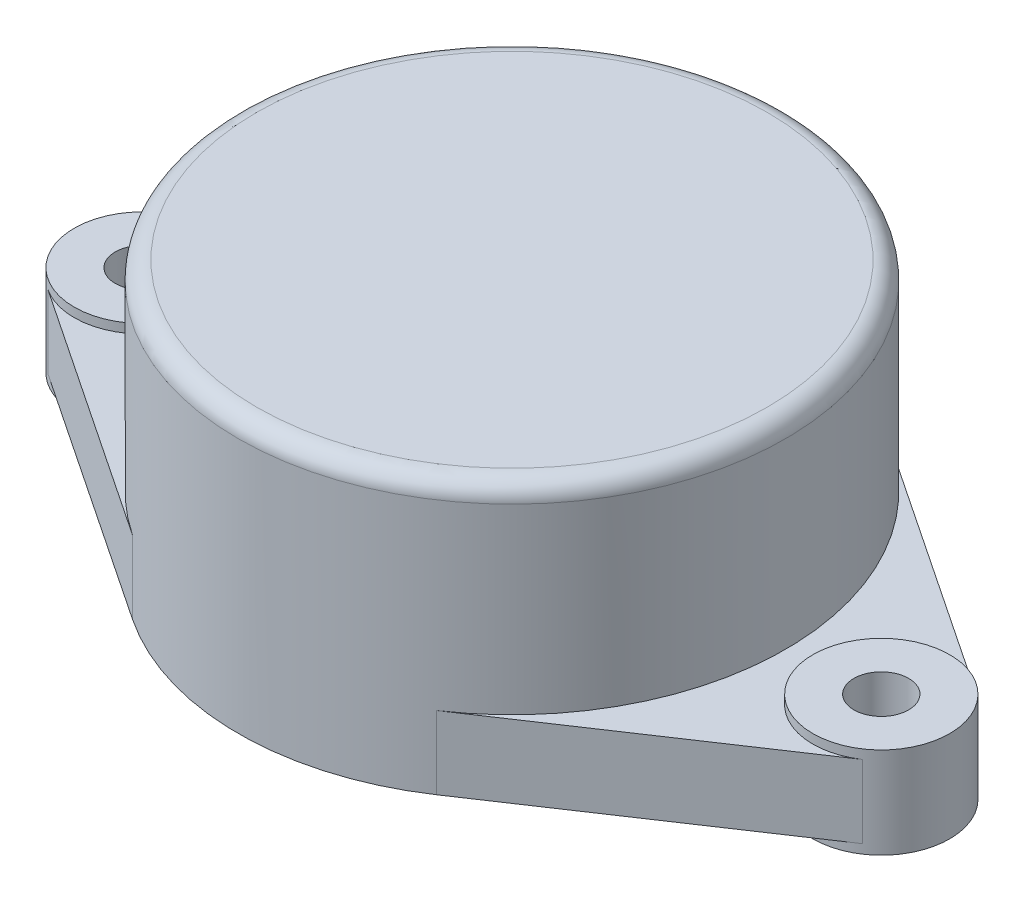
ISO-10303-21;
HEADER;
FILE_DESCRIPTION(('STEP AP214'),'2;1');
FILE_NAME('part.step','',(''),(''),'','','');
FILE_SCHEMA(('AUTOMOTIVE_DESIGN { 1 0 10303 214 1 1 1 1 }'));
ENDSEC;
DATA;
#1=APPLICATION_CONTEXT('core data for automotive mechanical design processes');
#2=APPLICATION_PROTOCOL_DEFINITION('international standard','automotive_design',2000,#1);
#3=PRODUCT_CONTEXT('',#1,'mechanical');
#4=PRODUCT('Part','Part','',(#3));
#5=PRODUCT_RELATED_PRODUCT_CATEGORY('part','',(#4));
#6=PRODUCT_DEFINITION_FORMATION('','',#4);
#7=PRODUCT_DEFINITION_CONTEXT('part definition',#1,'design');
#8=PRODUCT_DEFINITION('design','',#6,#7);
#9=PRODUCT_DEFINITION_SHAPE('','',#8);
#10=(LENGTH_UNIT() NAMED_UNIT(*) SI_UNIT(.MILLI.,.METRE.));
#11=(NAMED_UNIT(*) PLANE_ANGLE_UNIT() SI_UNIT($,.RADIAN.));
#12=(NAMED_UNIT(*) SI_UNIT($,.STERADIAN.) SOLID_ANGLE_UNIT());
#13=UNCERTAINTY_MEASURE_WITH_UNIT(LENGTH_MEASURE(1.E-05),#10,'distance_accuracy_value','');
#14=(GEOMETRIC_REPRESENTATION_CONTEXT(3) GLOBAL_UNCERTAINTY_ASSIGNED_CONTEXT((#13)) GLOBAL_UNIT_ASSIGNED_CONTEXT((#10,
#11,#12)) REPRESENTATION_CONTEXT('',''));
#15=CARTESIAN_POINT('',(0.,0.,0.));
#16=DIRECTION('',(0.,0.,1.));
#17=DIRECTION('',(1.,0.,0.));
#18=AXIS2_PLACEMENT_3D('',#15,#16,#17);
#19=CARTESIAN_POINT('',(0.,15.,0.));
#20=DIRECTION('',(0.,-1.,0.));
#21=DIRECTION('',(0.,0.,-1.));
#22=AXIS2_PLACEMENT_3D('',#19,#20,#21);
#23=CYLINDRICAL_SURFACE('',#22,15.);
#24=CARTESIAN_POINT('',(0.,14.,0.));
#25=DIRECTION('',(0.,1.,0.));
#26=DIRECTION('',(0.,0.,1.));
#27=AXIS2_PLACEMENT_3D('',#24,#25,#26);
#28=CIRCLE('',#27,15.);
#29=CARTESIAN_POINT('',(0.,14.,15.));
#30=VERTEX_POINT('',#29);
#31=EDGE_CURVE('E11',#30,#30,#28,.F.);
#32=ORIENTED_EDGE('',*,*,#31,.T.);
#33=EDGE_LOOP('',(#32));
#34=FACE_BOUND('',#33,.T.);
#35=CARTESIAN_POINT('',(0.,4.,0.));
#36=DIRECTION('',(0.,1.,0.));
#37=DIRECTION('',(0.,0.,1.));
#38=AXIS2_PLACEMENT_3D('',#35,#36,#37);
#39=CIRCLE('',#38,15.);
#40=CARTESIAN_POINT('',(8.33333333333334,4.,-12.4721912892465));
#41=VERTEX_POINT('',#40);
#42=CARTESIAN_POINT('',(8.33333333333334,4.,12.4721912892465));
#43=VERTEX_POINT('',#42);
#44=EDGE_CURVE('E56',#41,#43,#39,.F.);
#45=ORIENTED_EDGE('',*,*,#44,.F.);
#46=DIRECTION('',(0.,-1.,0.));
#47=VECTOR('',#46,1.);
#48=CARTESIAN_POINT('',(8.33333333333334,4.,-12.4721912892465));
#49=LINE('',#48,#47);
#50=CARTESIAN_POINT('',(8.33333333333334,0.,-12.4721912892465));
#51=VERTEX_POINT('',#50);
#52=EDGE_CURVE('E155',#41,#51,#49,.T.);
#53=ORIENTED_EDGE('',*,*,#52,.T.);
#54=CARTESIAN_POINT('',(0.,0.,0.));
#55=DIRECTION('',(0.,1.,0.));
#56=DIRECTION('',(0.,0.,1.));
#57=AXIS2_PLACEMENT_3D('',#54,#55,#56);
#58=CIRCLE('',#57,15.);
#59=CARTESIAN_POINT('',(-8.33333333333334,0.,-12.4721912892465));
#60=VERTEX_POINT('',#59);
#61=EDGE_CURVE('E134',#51,#60,#58,.T.);
#62=ORIENTED_EDGE('',*,*,#61,.T.);
#63=DIRECTION('',(0.,-1.,0.));
#64=VECTOR('',#63,1.);
#65=CARTESIAN_POINT('',(-8.33333333333334,4.,-12.4721912892465));
#66=LINE('',#65,#64);
#67=CARTESIAN_POINT('',(-8.33333333333334,4.,-12.4721912892465));
#68=VERTEX_POINT('',#67);
#69=EDGE_CURVE('E135',#68,#60,#66,.T.);
#70=ORIENTED_EDGE('',*,*,#69,.F.);
#71=CARTESIAN_POINT('',(0.,4.,0.));
#72=DIRECTION('',(0.,1.,0.));
#73=DIRECTION('',(0.,0.,1.));
#74=AXIS2_PLACEMENT_3D('',#71,#72,#73);
#75=CIRCLE('',#74,15.);
#76=CARTESIAN_POINT('',(-8.33333333333334,4.,12.4721912892465));
#77=VERTEX_POINT('',#76);
#78=EDGE_CURVE('E151',#68,#77,#75,.T.);
#79=ORIENTED_EDGE('',*,*,#78,.T.);
#80=DIRECTION('',(0.,-1.,0.));
#81=VECTOR('',#80,1.);
#82=CARTESIAN_POINT('',(-8.33333333333334,4.,12.4721912892465));
#83=LINE('',#82,#81);
#84=CARTESIAN_POINT('',(-8.33333333333334,0.,12.4721912892465));
#85=VERTEX_POINT('',#84);
#86=EDGE_CURVE('E144',#77,#85,#83,.T.);
#87=ORIENTED_EDGE('',*,*,#86,.T.);
#88=CARTESIAN_POINT('',(8.33333333333334,0.,12.4721912892465));
#89=VERTEX_POINT('',#88);
#90=EDGE_CURVE('E130',#85,#89,#58,.T.);
#91=ORIENTED_EDGE('',*,*,#90,.T.);
#92=DIRECTION('',(0.,-1.,0.));
#93=VECTOR('',#92,1.);
#94=CARTESIAN_POINT('',(8.33333333333334,4.,12.4721912892465));
#95=LINE('',#94,#93);
#96=EDGE_CURVE('E61',#43,#89,#95,.T.);
#97=ORIENTED_EDGE('',*,*,#96,.F.);
#98=EDGE_LOOP('',(#45,#53,#62,#70,#79,#87,#91,#97));
#99=FACE_BOUND('',#98,.T.);
#100=ADVANCED_FACE('F41',(#34,#99),#23,.T.);
#101=CARTESIAN_POINT('',(0.,15.,0.));
#102=DIRECTION('',(0.,1.,0.));
#103=DIRECTION('',(0.,0.,1.));
#104=AXIS2_PLACEMENT_3D('',#101,#102,#103);
#105=PLANE('',#104);
#106=CARTESIAN_POINT('',(0.,15.,0.));
#107=DIRECTION('',(0.,1.,0.));
#108=DIRECTION('',(0.,0.,1.));
#109=AXIS2_PLACEMENT_3D('',#106,#107,#108);
#110=CIRCLE('',#109,14.);
#111=CARTESIAN_POINT('',(0.,15.,14.));
#112=VERTEX_POINT('',#111);
#113=EDGE_CURVE('E49',#112,#112,#110,.T.);
#114=ORIENTED_EDGE('',*,*,#113,.T.);
#115=EDGE_LOOP('',(#114));
#116=FACE_BOUND('',#115,.T.);
#117=ADVANCED_FACE('F218',(#116),#105,.T.);
#118=CARTESIAN_POINT('',(0.,0.,0.));
#119=DIRECTION('',(0.,1.,0.));
#120=DIRECTION('',(0.,0.,1.));
#121=AXIS2_PLACEMENT_3D('',#118,#119,#120);
#122=PLANE('',#121);
#123=DIRECTION('',(0.831479419283098,0.,0.555555555555556));
#124=VECTOR('',#123,1.);
#125=CARTESIAN_POINT('',(8.33333333333334,0.,-12.4721912892465));
#126=LINE('',#125,#124);
#127=CARTESIAN_POINT('',(22.3333333333333,0.,-3.11804782231161));
#128=VERTEX_POINT('',#127);
#129=EDGE_CURVE('E167',#51,#128,#126,.T.);
#130=ORIENTED_EDGE('',*,*,#129,.T.);
#131=CARTESIAN_POINT('',(20.25,0.,0.));
#132=DIRECTION('',(0.,1.,0.));
#133=DIRECTION('',(0.,0.,1.));
#134=AXIS2_PLACEMENT_3D('',#131,#132,#133);
#135=CIRCLE('',#134,3.74999999999999);
#136=CARTESIAN_POINT('',(22.3333333333333,0.,3.11804782231161));
#137=VERTEX_POINT('',#136);
#138=EDGE_CURVE('E186',#128,#137,#135,.T.);
#139=ORIENTED_EDGE('',*,*,#138,.T.);
#140=DIRECTION('',(0.831479419283098,0.,-0.555555555555556));
#141=VECTOR('',#140,1.);
#142=CARTESIAN_POINT('',(8.33333333333334,0.,12.4721912892465));
#143=LINE('',#142,#141);
#144=EDGE_CURVE('E111',#89,#137,#143,.T.);
#145=ORIENTED_EDGE('',*,*,#144,.F.);
#146=ORIENTED_EDGE('',*,*,#90,.F.);
#147=DIRECTION('',(0.831479419283098,0.,0.555555555555556));
#148=VECTOR('',#147,1.);
#149=CARTESIAN_POINT('',(-8.33333333333334,0.,12.4721912892465));
#150=LINE('',#149,#148);
#151=CARTESIAN_POINT('',(-22.3333333333333,0.,3.11804782231161));
#152=VERTEX_POINT('',#151);
#153=EDGE_CURVE('E148',#152,#85,#150,.T.);
#154=ORIENTED_EDGE('',*,*,#153,.F.);
#155=CARTESIAN_POINT('',(-20.25,0.,0.));
#156=DIRECTION('',(0.,1.,0.));
#157=DIRECTION('',(0.,0.,1.));
#158=AXIS2_PLACEMENT_3D('',#155,#156,#157);
#159=CIRCLE('',#158,3.74999999999999);
#160=CARTESIAN_POINT('',(-22.3333333333333,0.,-3.11804782231161));
#161=VERTEX_POINT('',#160);
#162=EDGE_CURVE('E169',#152,#161,#159,.T.);
#163=ORIENTED_EDGE('',*,*,#162,.T.);
#164=DIRECTION('',(0.831479419283098,0.,-0.555555555555556));
#165=VECTOR('',#164,1.);
#166=CARTESIAN_POINT('',(-8.33333333333334,0.,-12.4721912892465));
#167=LINE('',#166,#165);
#168=EDGE_CURVE('E152',#161,#60,#167,.T.);
#169=ORIENTED_EDGE('',*,*,#168,.T.);
#170=ORIENTED_EDGE('',*,*,#61,.F.);
#171=EDGE_LOOP('',(#130,#139,#145,#146,#154,#163,#169,#170));
#172=FACE_BOUND('',#171,.T.);
#173=ADVANCED_FACE('F223',(#172),#122,.F.);
#174=CARTESIAN_POINT('',(-8.33333333333334,4.,-12.4721912892465));
#175=DIRECTION('',(-0.555555555555556,0.,-0.831479419283098));
#176=DIRECTION('',(-0.831479419283098,0.,0.555555555555556));
#177=AXIS2_PLACEMENT_3D('',#174,#175,#176);
#178=PLANE('',#177);
#179=ORIENTED_EDGE('',*,*,#168,.F.);
#180=DIRECTION('',(0.,-1.,0.));
#181=VECTOR('',#180,1.);
#182=CARTESIAN_POINT('',(-22.3333333333333,4.,-3.11804782231161));
#183=LINE('',#182,#181);
#184=CARTESIAN_POINT('',(-22.3333333333333,4.,-3.11804782231161));
#185=VERTEX_POINT('',#184);
#186=EDGE_CURVE('E138',#185,#161,#183,.T.);
#187=ORIENTED_EDGE('',*,*,#186,.F.);
#188=DIRECTION('',(0.831479419283098,0.,-0.555555555555556));
#189=VECTOR('',#188,1.);
#190=CARTESIAN_POINT('',(-8.33333333333334,4.,-12.4721912892465));
#191=LINE('',#190,#189);
#192=EDGE_CURVE('E158',#185,#68,#191,.T.);
#193=ORIENTED_EDGE('',*,*,#192,.T.);
#194=ORIENTED_EDGE('',*,*,#69,.T.);
#195=EDGE_LOOP('',(#179,#187,#193,#194));
#196=FACE_BOUND('',#195,.T.);
#197=ADVANCED_FACE('F228',(#196),#178,.T.);
#198=CARTESIAN_POINT('',(-20.25,4.,0.));
#199=DIRECTION('',(0.,-1.,0.));
#200=DIRECTION('',(0.,0.,-1.));
#201=AXIS2_PLACEMENT_3D('',#198,#199,#200);
#202=CYLINDRICAL_SURFACE('',#201,3.74999999999999);
#203=ORIENTED_EDGE('',*,*,#186,.T.);
#204=ORIENTED_EDGE('',*,*,#162,.F.);
#205=DIRECTION('',(0.,-1.,0.));
#206=VECTOR('',#205,1.);
#207=CARTESIAN_POINT('',(-22.3333333333333,4.,3.11804782231161));
#208=LINE('',#207,#206);
#209=CARTESIAN_POINT('',(-22.3333333333333,4.,3.11804782231161));
#210=VERTEX_POINT('',#209);
#211=EDGE_CURVE('E141',#210,#152,#208,.T.);
#212=ORIENTED_EDGE('',*,*,#211,.F.);
#213=CARTESIAN_POINT('',(-20.25,4.,0.));
#214=DIRECTION('',(0.,1.,0.));
#215=DIRECTION('',(0.,0.,1.));
#216=AXIS2_PLACEMENT_3D('',#213,#214,#215);
#217=CIRCLE('',#216,3.74999999999999);
#218=EDGE_CURVE('E126',#210,#185,#217,.T.);
#219=ORIENTED_EDGE('',*,*,#218,.T.);
#220=EDGE_LOOP('',(#203,#204,#212,#219));
#221=FACE_BOUND('',#220,.T.);
#222=CARTESIAN_POINT('',(-20.25,4.5,0.));
#223=DIRECTION('',(0.,1.,0.));
#224=DIRECTION('',(0.,0.,1.));
#225=AXIS2_PLACEMENT_3D('',#222,#223,#224);
#226=CIRCLE('',#225,3.74999999999999);
#227=CARTESIAN_POINT('',(-20.25,4.5,3.74999999999999));
#228=VERTEX_POINT('',#227);
#229=EDGE_CURVE('E180',#228,#228,#226,.T.);
#230=ORIENTED_EDGE('',*,*,#229,.F.);
#231=EDGE_LOOP('',(#230));
#232=FACE_BOUND('',#231,.T.);
#233=CARTESIAN_POINT('',(-20.25,-0.5,0.));
#234=DIRECTION('',(0.,1.,0.));
#235=DIRECTION('',(0.,0.,1.));
#236=AXIS2_PLACEMENT_3D('',#233,#234,#235);
#237=CIRCLE('',#236,3.74999999999999);
#238=CARTESIAN_POINT('',(-20.25,-0.5,3.74999999999999));
#239=VERTEX_POINT('',#238);
#240=EDGE_CURVE('E174',#239,#239,#237,.T.);
#241=ORIENTED_EDGE('',*,*,#240,.T.);
#242=EDGE_LOOP('',(#241));
#243=FACE_BOUND('',#242,.T.);
#244=ADVANCED_FACE('F233',(#221,#232,#243),#202,.T.);
#245=CARTESIAN_POINT('',(-8.33333333333334,4.,12.4721912892465));
#246=DIRECTION('',(0.555555555555556,0.,-0.831479419283098));
#247=DIRECTION('',(-0.831479419283098,0.,-0.555555555555556));
#248=AXIS2_PLACEMENT_3D('',#245,#246,#247);
#249=PLANE('',#248);
#250=ORIENTED_EDGE('',*,*,#153,.T.);
#251=ORIENTED_EDGE('',*,*,#86,.F.);
#252=DIRECTION('',(0.831479419283098,0.,0.555555555555556));
#253=VECTOR('',#252,1.);
#254=CARTESIAN_POINT('',(-8.33333333333334,4.,12.4721912892465));
#255=LINE('',#254,#253);
#256=EDGE_CURVE('E147',#210,#77,#255,.T.);
#257=ORIENTED_EDGE('',*,*,#256,.F.);
#258=ORIENTED_EDGE('',*,*,#211,.T.);
#259=EDGE_LOOP('',(#250,#251,#257,#258));
#260=FACE_BOUND('',#259,.T.);
#261=ADVANCED_FACE('F237',(#260),#249,.F.);
#262=CARTESIAN_POINT('',(0.,4.,0.));
#263=DIRECTION('',(0.,1.,0.));
#264=DIRECTION('',(0.,0.,1.));
#265=AXIS2_PLACEMENT_3D('',#262,#263,#264);
#266=PLANE('',#265);
#267=ORIENTED_EDGE('',*,*,#218,.F.);
#268=ORIENTED_EDGE('',*,*,#256,.T.);
#269=ORIENTED_EDGE('',*,*,#78,.F.);
#270=ORIENTED_EDGE('',*,*,#192,.F.);
#271=EDGE_LOOP('',(#267,#268,#269,#270));
#272=FACE_BOUND('',#271,.T.);
#273=ADVANCED_FACE('F241',(#272),#266,.T.);
#274=CARTESIAN_POINT('',(8.33333333333334,4.,-12.4721912892465));
#275=DIRECTION('',(0.555555555555556,0.,-0.831479419283098));
#276=DIRECTION('',(-0.831479419283098,0.,-0.555555555555556));
#277=AXIS2_PLACEMENT_3D('',#274,#275,#276);
#278=PLANE('',#277);
#279=ORIENTED_EDGE('',*,*,#129,.F.);
#280=ORIENTED_EDGE('',*,*,#52,.F.);
#281=DIRECTION('',(0.831479419283098,0.,0.555555555555556));
#282=VECTOR('',#281,1.);
#283=CARTESIAN_POINT('',(8.33333333333334,4.,-12.4721912892465));
#284=LINE('',#283,#282);
#285=CARTESIAN_POINT('',(22.3333333333333,4.,-3.11804782231161));
#286=VERTEX_POINT('',#285);
#287=EDGE_CURVE('E166',#41,#286,#284,.T.);
#288=ORIENTED_EDGE('',*,*,#287,.T.);
#289=DIRECTION('',(0.,-1.,0.));
#290=VECTOR('',#289,1.);
#291=CARTESIAN_POINT('',(22.3333333333333,4.,-3.11804782231161));
#292=LINE('',#291,#290);
#293=EDGE_CURVE('E114',#286,#128,#292,.T.);
#294=ORIENTED_EDGE('',*,*,#293,.T.);
#295=EDGE_LOOP('',(#279,#280,#288,#294));
#296=FACE_BOUND('',#295,.T.);
#297=ADVANCED_FACE('F248',(#296),#278,.T.);
#298=CARTESIAN_POINT('',(8.33333333333334,4.,12.4721912892465));
#299=DIRECTION('',(-0.555555555555556,0.,-0.831479419283098));
#300=DIRECTION('',(-0.831479419283098,0.,0.555555555555556));
#301=AXIS2_PLACEMENT_3D('',#298,#299,#300);
#302=PLANE('',#301);
#303=ORIENTED_EDGE('',*,*,#144,.T.);
#304=DIRECTION('',(0.,-1.,0.));
#305=VECTOR('',#304,1.);
#306=CARTESIAN_POINT('',(22.3333333333333,4.,3.11804782231161));
#307=LINE('',#306,#305);
#308=CARTESIAN_POINT('',(22.3333333333333,4.,3.11804782231161));
#309=VERTEX_POINT('',#308);
#310=EDGE_CURVE('E106',#309,#137,#307,.T.);
#311=ORIENTED_EDGE('',*,*,#310,.F.);
#312=DIRECTION('',(0.831479419283098,0.,-0.555555555555556));
#313=VECTOR('',#312,1.);
#314=CARTESIAN_POINT('',(8.33333333333334,4.,12.4721912892465));
#315=LINE('',#314,#313);
#316=EDGE_CURVE('E109',#43,#309,#315,.T.);
#317=ORIENTED_EDGE('',*,*,#316,.F.);
#318=ORIENTED_EDGE('',*,*,#96,.T.);
#319=EDGE_LOOP('',(#303,#311,#317,#318));
#320=FACE_BOUND('',#319,.T.);
#321=ADVANCED_FACE('F108',(#320),#302,.F.);
#322=CARTESIAN_POINT('',(20.25,4.,0.));
#323=DIRECTION('',(0.,-1.,0.));
#324=DIRECTION('',(0.,0.,-1.));
#325=AXIS2_PLACEMENT_3D('',#322,#323,#324);
#326=CYLINDRICAL_SURFACE('',#325,3.74999999999999);
#327=ORIENTED_EDGE('',*,*,#310,.T.);
#328=ORIENTED_EDGE('',*,*,#138,.F.);
#329=ORIENTED_EDGE('',*,*,#293,.F.);
#330=CARTESIAN_POINT('',(20.25,4.,0.));
#331=DIRECTION('',(0.,1.,0.));
#332=DIRECTION('',(0.,0.,1.));
#333=AXIS2_PLACEMENT_3D('',#330,#331,#332);
#334=CIRCLE('',#333,3.74999999999999);
#335=EDGE_CURVE('E119',#286,#309,#334,.T.);
#336=ORIENTED_EDGE('',*,*,#335,.T.);
#337=EDGE_LOOP('',(#327,#328,#329,#336));
#338=FACE_BOUND('',#337,.T.);
#339=CARTESIAN_POINT('',(20.25,4.5,0.));
#340=DIRECTION('',(0.,1.,0.));
#341=DIRECTION('',(0.,0.,1.));
#342=AXIS2_PLACEMENT_3D('',#339,#340,#341);
#343=CIRCLE('',#342,3.74999999999999);
#344=CARTESIAN_POINT('',(20.25,4.5,3.74999999999999));
#345=VERTEX_POINT('',#344);
#346=EDGE_CURVE('E191',#345,#345,#343,.T.);
#347=ORIENTED_EDGE('',*,*,#346,.F.);
#348=EDGE_LOOP('',(#347));
#349=FACE_BOUND('',#348,.T.);
#350=CARTESIAN_POINT('',(20.25,-0.5,0.));
#351=DIRECTION('',(0.,1.,0.));
#352=DIRECTION('',(0.,0.,1.));
#353=AXIS2_PLACEMENT_3D('',#350,#351,#352);
#354=CIRCLE('',#353,3.74999999999999);
#355=CARTESIAN_POINT('',(20.25,-0.5,3.74999999999999));
#356=VERTEX_POINT('',#355);
#357=EDGE_CURVE('E197',#356,#356,#354,.T.);
#358=ORIENTED_EDGE('',*,*,#357,.T.);
#359=EDGE_LOOP('',(#358));
#360=FACE_BOUND('',#359,.T.);
#361=ADVANCED_FACE('F122',(#338,#349,#360),#326,.T.);
#362=CARTESIAN_POINT('',(0.,4.,0.));
#363=DIRECTION('',(0.,1.,0.));
#364=DIRECTION('',(0.,0.,1.));
#365=AXIS2_PLACEMENT_3D('',#362,#363,#364);
#366=PLANE('',#365);
#367=ORIENTED_EDGE('',*,*,#335,.F.);
#368=ORIENTED_EDGE('',*,*,#287,.F.);
#369=ORIENTED_EDGE('',*,*,#44,.T.);
#370=ORIENTED_EDGE('',*,*,#316,.T.);
#371=EDGE_LOOP('',(#367,#368,#369,#370));
#372=FACE_BOUND('',#371,.T.);
#373=ADVANCED_FACE('F117',(#372),#366,.T.);
#374=CARTESIAN_POINT('',(-20.25,4.5,0.));
#375=DIRECTION('',(0.,1.,0.));
#376=DIRECTION('',(0.,0.,1.));
#377=AXIS2_PLACEMENT_3D('',#374,#375,#376);
#378=PLANE('',#377);
#379=ORIENTED_EDGE('',*,*,#229,.T.);
#380=EDGE_LOOP('',(#379));
#381=FACE_BOUND('',#380,.T.);
#382=CARTESIAN_POINT('',(-20.25,4.5,0.));
#383=DIRECTION('',(0.,1.,0.));
#384=DIRECTION('',(0.,0.,1.));
#385=AXIS2_PLACEMENT_3D('',#382,#383,#384);
#386=CIRCLE('',#385,1.5);
#387=CARTESIAN_POINT('',(-20.25,4.5,1.5));
#388=VERTEX_POINT('',#387);
#389=EDGE_CURVE('E183',#388,#388,#386,.T.);
#390=ORIENTED_EDGE('',*,*,#389,.F.);
#391=EDGE_LOOP('',(#390));
#392=FACE_BOUND('',#391,.T.);
#393=ADVANCED_FACE('F260',(#381,#392),#378,.T.);
#394=CARTESIAN_POINT('',(-20.25,-0.5,0.));
#395=DIRECTION('',(0.,1.,0.));
#396=DIRECTION('',(0.,0.,1.));
#397=AXIS2_PLACEMENT_3D('',#394,#395,#396);
#398=PLANE('',#397);
#399=CARTESIAN_POINT('',(-20.25,-0.5,0.));
#400=DIRECTION('',(0.,1.,0.));
#401=DIRECTION('',(0.,0.,1.));
#402=AXIS2_PLACEMENT_3D('',#399,#400,#401);
#403=CIRCLE('',#402,1.5);
#404=CARTESIAN_POINT('',(-20.25,-0.5,1.5));
#405=VERTEX_POINT('',#404);
#406=EDGE_CURVE('E177',#405,#405,#403,.T.);
#407=ORIENTED_EDGE('',*,*,#406,.T.);
#408=EDGE_LOOP('',(#407));
#409=FACE_BOUND('',#408,.T.);
#410=ORIENTED_EDGE('',*,*,#240,.F.);
#411=EDGE_LOOP('',(#410));
#412=FACE_BOUND('',#411,.T.);
#413=ADVANCED_FACE('F245',(#409,#412),#398,.F.);
#414=CARTESIAN_POINT('',(-20.25,4.,0.));
#415=DIRECTION('',(0.,-1.,0.));
#416=DIRECTION('',(0.,0.,-1.));
#417=AXIS2_PLACEMENT_3D('',#414,#415,#416);
#418=CYLINDRICAL_SURFACE('',#417,1.5);
#419=ORIENTED_EDGE('',*,*,#389,.T.);
#420=EDGE_LOOP('',(#419));
#421=FACE_BOUND('',#420,.T.);
#422=ORIENTED_EDGE('',*,*,#406,.F.);
#423=EDGE_LOOP('',(#422));
#424=FACE_BOUND('',#423,.T.);
#425=ADVANCED_FACE('F214',(#421,#424),#418,.F.);
#426=CARTESIAN_POINT('',(20.25,4.5,0.));
#427=DIRECTION('',(0.,1.,0.));
#428=DIRECTION('',(0.,0.,1.));
#429=AXIS2_PLACEMENT_3D('',#426,#427,#428);
#430=PLANE('',#429);
#431=ORIENTED_EDGE('',*,*,#346,.T.);
#432=EDGE_LOOP('',(#431));
#433=FACE_BOUND('',#432,.T.);
#434=CARTESIAN_POINT('',(20.25,4.5,0.));
#435=DIRECTION('',(0.,1.,0.));
#436=DIRECTION('',(0.,0.,1.));
#437=AXIS2_PLACEMENT_3D('',#434,#435,#436);
#438=CIRCLE('',#437,1.5);
#439=CARTESIAN_POINT('',(20.25,4.5,1.5));
#440=VERTEX_POINT('',#439);
#441=EDGE_CURVE('E188',#440,#440,#438,.T.);
#442=ORIENTED_EDGE('',*,*,#441,.F.);
#443=EDGE_LOOP('',(#442));
#444=FACE_BOUND('',#443,.T.);
#445=ADVANCED_FACE('F205',(#433,#444),#430,.T.);
#446=CARTESIAN_POINT('',(20.25,-0.5,0.));
#447=DIRECTION('',(0.,1.,0.));
#448=DIRECTION('',(0.,0.,1.));
#449=AXIS2_PLACEMENT_3D('',#446,#447,#448);
#450=PLANE('',#449);
#451=CARTESIAN_POINT('',(20.25,-0.5,0.));
#452=DIRECTION('',(0.,1.,0.));
#453=DIRECTION('',(0.,0.,1.));
#454=AXIS2_PLACEMENT_3D('',#451,#452,#453);
#455=CIRCLE('',#454,1.5);
#456=CARTESIAN_POINT('',(20.25,-0.5,1.5));
#457=VERTEX_POINT('',#456);
#458=EDGE_CURVE('E194',#457,#457,#455,.T.);
#459=ORIENTED_EDGE('',*,*,#458,.T.);
#460=EDGE_LOOP('',(#459));
#461=FACE_BOUND('',#460,.T.);
#462=ORIENTED_EDGE('',*,*,#357,.F.);
#463=EDGE_LOOP('',(#462));
#464=FACE_BOUND('',#463,.T.);
#465=ADVANCED_FACE('F202',(#461,#464),#450,.F.);
#466=CARTESIAN_POINT('',(20.25,4.,0.));
#467=DIRECTION('',(0.,-1.,0.));
#468=DIRECTION('',(0.,0.,-1.));
#469=AXIS2_PLACEMENT_3D('',#466,#467,#468);
#470=CYLINDRICAL_SURFACE('',#469,1.5);
#471=ORIENTED_EDGE('',*,*,#441,.T.);
#472=EDGE_LOOP('',(#471));
#473=FACE_BOUND('',#472,.T.);
#474=ORIENTED_EDGE('',*,*,#458,.F.);
#475=EDGE_LOOP('',(#474));
#476=FACE_BOUND('',#475,.T.);
#477=ADVANCED_FACE('F204',(#473,#476),#470,.F.);
#478=CARTESIAN_POINT('',(0.,14.,0.));
#479=DIRECTION('',(0.,1.,0.));
#480=DIRECTION('',(0.,0.,1.));
#481=AXIS2_PLACEMENT_3D('',#478,#479,#480);
#482=TOROIDAL_SURFACE('',#481,14.,1.);
#483=ORIENTED_EDGE('',*,*,#31,.F.);
#484=EDGE_LOOP('',(#483));
#485=FACE_BOUND('',#484,.T.);
#486=ORIENTED_EDGE('',*,*,#113,.F.);
#487=EDGE_LOOP('',(#486));
#488=FACE_BOUND('',#487,.T.);
#489=ADVANCED_FACE('F43',(#485,#488),#482,.T.);
#490=CLOSED_SHELL('',(#100,#117,#173,#197,#244,#261,#273,#297,#321,#361,#373,#393,#413,#425,
#445,#465,#477,#489));
#491=MANIFOLD_SOLID_BREP('B2',#490);
#492=ADVANCED_BREP_SHAPE_REPRESENTATION('',(#18,#491),#14);
#493=SHAPE_DEFINITION_REPRESENTATION(#9,#492);
ENDSEC;
END-ISO-10303-21;
